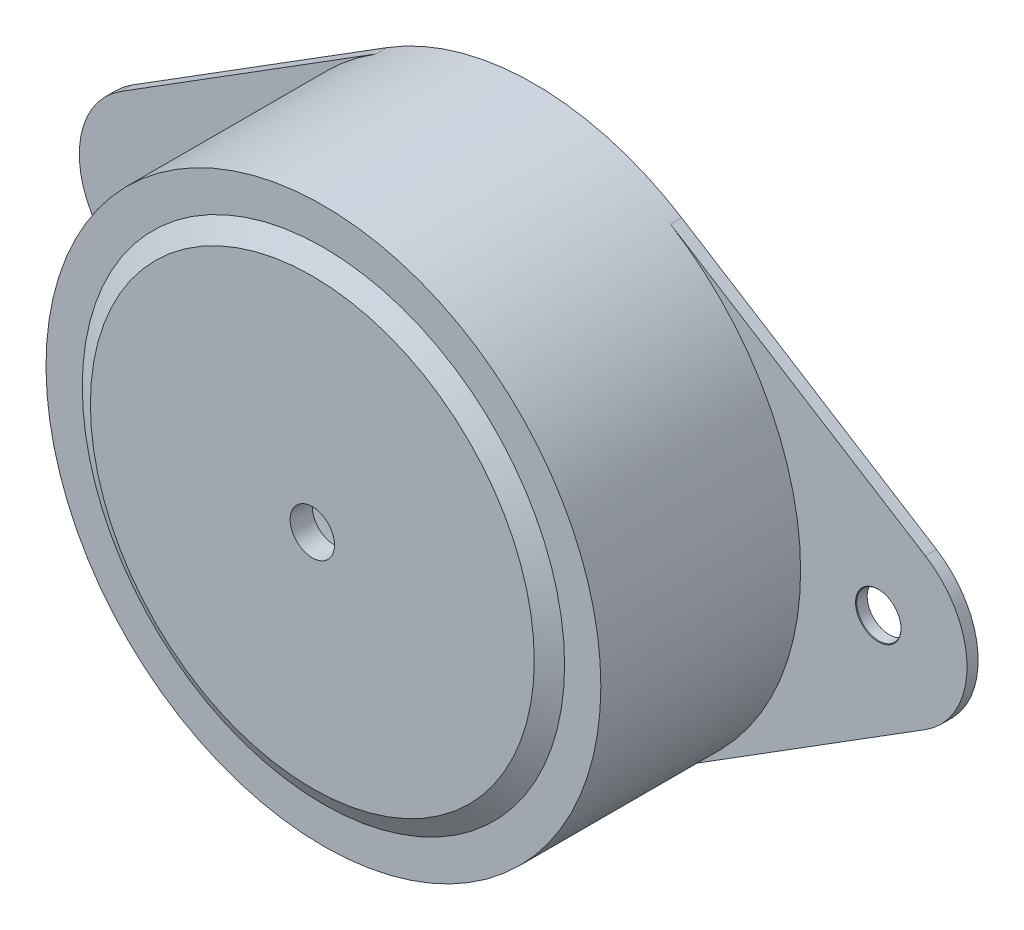
ISO-10303-21;
HEADER;
FILE_DESCRIPTION(('STEP AP214'),'2;1');
FILE_NAME('part.step','',(''),(''),'','','');
FILE_SCHEMA(('AUTOMOTIVE_DESIGN { 1 0 10303 214 1 1 1 1 }'));
ENDSEC;
DATA;
#1=APPLICATION_CONTEXT('core data for automotive mechanical design processes');
#2=APPLICATION_PROTOCOL_DEFINITION('international standard','automotive_design',2000,#1);
#3=PRODUCT_CONTEXT('',#1,'mechanical');
#4=PRODUCT('Part','Part','',(#3));
#5=PRODUCT_RELATED_PRODUCT_CATEGORY('part','',(#4));
#6=PRODUCT_DEFINITION_FORMATION('','',#4);
#7=PRODUCT_DEFINITION_CONTEXT('part definition',#1,'design');
#8=PRODUCT_DEFINITION('design','',#6,#7);
#9=PRODUCT_DEFINITION_SHAPE('','',#8);
#10=(LENGTH_UNIT() NAMED_UNIT(*) SI_UNIT(.MILLI.,.METRE.));
#11=(NAMED_UNIT(*) PLANE_ANGLE_UNIT() SI_UNIT($,.RADIAN.));
#12=(NAMED_UNIT(*) SI_UNIT($,.STERADIAN.) SOLID_ANGLE_UNIT());
#13=UNCERTAINTY_MEASURE_WITH_UNIT(LENGTH_MEASURE(1.E-05),#10,'distance_accuracy_value','');
#14=(GEOMETRIC_REPRESENTATION_CONTEXT(3) GLOBAL_UNCERTAINTY_ASSIGNED_CONTEXT((#13)) GLOBAL_UNIT_ASSIGNED_CONTEXT((#10,
#11,#12)) REPRESENTATION_CONTEXT('',''));
#15=CARTESIAN_POINT('',(0.,0.,0.));
#16=DIRECTION('',(0.,0.,1.));
#17=DIRECTION('',(1.,0.,0.));
#18=AXIS2_PLACEMENT_3D('',#15,#16,#17);
#19=CARTESIAN_POINT('',(0.,0.,9.));
#20=DIRECTION('',(0.,0.,-1.));
#21=DIRECTION('',(-1.,0.,0.));
#22=AXIS2_PLACEMENT_3D('',#19,#20,#21);
#23=CYLINDRICAL_SURFACE('',#22,12.);
#24=CARTESIAN_POINT('',(0.,0.,9.));
#25=DIRECTION('',(0.,0.,-1.));
#26=DIRECTION('',(-1.,0.,0.));
#27=AXIS2_PLACEMENT_3D('',#24,#25,#26);
#28=CIRCLE('',#27,12.);
#29=CARTESIAN_POINT('',(-12.,0.,9.));
#30=VERTEX_POINT('',#29);
#31=EDGE_CURVE('E207',#30,#30,#28,.T.);
#32=ORIENTED_EDGE('',*,*,#31,.F.);
#33=EDGE_LOOP('',(#32));
#34=FACE_BOUND('',#33,.T.);
#35=CARTESIAN_POINT('',(0.,0.,0.5));
#36=DIRECTION('',(0.,0.,-1.));
#37=DIRECTION('',(-1.,0.,0.));
#38=AXIS2_PLACEMENT_3D('',#35,#36,#37);
#39=CIRCLE('',#38,12.);
#40=CARTESIAN_POINT('',(-12.,0.,0.5));
#41=VERTEX_POINT('',#40);
#42=EDGE_CURVE('E13',#41,#41,#39,.F.);
#43=ORIENTED_EDGE('',*,*,#42,.F.);
#44=EDGE_LOOP('',(#43));
#45=FACE_BOUND('',#44,.T.);
#46=ADVANCED_FACE('F53',(#34,#45),#23,.F.);
#47=CARTESIAN_POINT('',(0.,0.,-2.50000000007189E-05));
#48=DIRECTION('',(0.,0.,1.));
#49=DIRECTION('',(1.,0.,0.));
#50=AXIS2_PLACEMENT_3D('',#47,#48,#49);
#51=CYLINDRICAL_SURFACE('',#50,1.);
#52=CARTESIAN_POINT('',(0.,0.,10.));
#53=DIRECTION('',(0.,0.,1.));
#54=DIRECTION('',(1.,0.,0.));
#55=AXIS2_PLACEMENT_3D('',#52,#53,#54);
#56=CIRCLE('',#55,1.);
#57=CARTESIAN_POINT('',(1.,0.,10.));
#58=VERTEX_POINT('',#57);
#59=EDGE_CURVE('E198',#58,#58,#56,.T.);
#60=ORIENTED_EDGE('',*,*,#59,.T.);
#61=EDGE_LOOP('',(#60));
#62=FACE_BOUND('',#61,.T.);
#63=CARTESIAN_POINT('',(0.,0.,9.));
#64=DIRECTION('',(0.,0.,-1.));
#65=DIRECTION('',(-1.,0.,0.));
#66=AXIS2_PLACEMENT_3D('',#63,#64,#65);
#67=CIRCLE('',#66,1.);
#68=CARTESIAN_POINT('',(-1.,0.,9.));
#69=VERTEX_POINT('',#68);
#70=EDGE_CURVE('E204',#69,#69,#67,.F.);
#71=ORIENTED_EDGE('',*,*,#70,.F.);
#72=EDGE_LOOP('',(#71));
#73=FACE_BOUND('',#72,.T.);
#74=ADVANCED_FACE('F285',(#62,#73),#51,.F.);
#75=CARTESIAN_POINT('',(-16.0000000000001,0.,0.5));
#76=DIRECTION('',(0.,0.,1.));
#77=DIRECTION('',(1.,0.,0.));
#78=AXIS2_PLACEMENT_3D('',#75,#76,#77);
#79=PLANE('',#78);
#80=CARTESIAN_POINT('',(-16.0000000000001,0.,0.5));
#81=DIRECTION('',(0.,0.,1.));
#82=DIRECTION('',(1.,0.,0.));
#83=AXIS2_PLACEMENT_3D('',#80,#81,#82);
#84=CIRCLE('',#83,1.025);
#85=CARTESIAN_POINT('',(-14.9750000000001,0.,0.5));
#86=VERTEX_POINT('',#85);
#87=EDGE_CURVE('E202',#86,#86,#84,.T.);
#88=ORIENTED_EDGE('',*,*,#87,.F.);
#89=EDGE_LOOP('',(#88));
#90=FACE_BOUND('',#89,.T.);
#91=CARTESIAN_POINT('',(0.,0.,0.5));
#92=DIRECTION('',(0.,0.,1.));
#93=DIRECTION('',(1.,0.,0.));
#94=AXIS2_PLACEMENT_3D('',#91,#92,#93);
#95=CIRCLE('',#94,12.5);
#96=CARTESIAN_POINT('',(-6.640625,10.5901888372859,0.5));
#97=VERTEX_POINT('',#96);
#98=CARTESIAN_POINT('',(-6.64062500000003,-10.590188837286,0.5));
#99=VERTEX_POINT('',#98);
#100=EDGE_CURVE('E164',#97,#99,#95,.T.);
#101=ORIENTED_EDGE('',*,*,#100,.F.);
#102=DIRECTION('',(-0.847215106982872,-0.53125,0.));
#103=VECTOR('',#102,1.);
#104=CARTESIAN_POINT('',(-18.125,3.38886042793138,0.5));
#105=LINE('',#104,#103);
#106=CARTESIAN_POINT('',(-18.125,3.38886042793138,0.5));
#107=VERTEX_POINT('',#106);
#108=EDGE_CURVE('E70',#97,#107,#105,.T.);
#109=ORIENTED_EDGE('',*,*,#108,.T.);
#110=CARTESIAN_POINT('',(-16.0000000000001,0.,0.5));
#111=DIRECTION('',(0.,0.,1.));
#112=DIRECTION('',(1.,0.,0.));
#113=AXIS2_PLACEMENT_3D('',#110,#111,#112);
#114=CIRCLE('',#113,4.);
#115=CARTESIAN_POINT('',(-18.125,-3.38886042793155,0.5));
#116=VERTEX_POINT('',#115);
#117=EDGE_CURVE('E179',#107,#116,#114,.T.);
#118=ORIENTED_EDGE('',*,*,#117,.T.);
#119=DIRECTION('',(0.847215106982873,-0.53125,0.));
#120=VECTOR('',#119,1.);
#121=CARTESIAN_POINT('',(-18.125,-3.38886042793155,0.5));
#122=LINE('',#121,#120);
#123=EDGE_CURVE('E115',#116,#99,#122,.T.);
#124=ORIENTED_EDGE('',*,*,#123,.T.);
#125=EDGE_LOOP('',(#101,#109,#118,#124));
#126=FACE_BOUND('',#125,.T.);
#127=ADVANCED_FACE('F291',(#90,#126),#79,.T.);
#128=CARTESIAN_POINT('',(-16.0000000000001,0.,0.5));
#129=DIRECTION('',(0.,0.,-1.));
#130=DIRECTION('',(-1.,0.,0.));
#131=AXIS2_PLACEMENT_3D('',#128,#129,#130);
#132=CYLINDRICAL_SURFACE('',#131,4.);
#133=CARTESIAN_POINT('',(-16.0000000000001,0.,0.));
#134=DIRECTION('',(0.,0.,1.));
#135=DIRECTION('',(1.,0.,0.));
#136=AXIS2_PLACEMENT_3D('',#133,#134,#135);
#137=CIRCLE('',#136,4.);
#138=CARTESIAN_POINT('',(-18.125,3.38886042793138,0.));
#139=VERTEX_POINT('',#138);
#140=CARTESIAN_POINT('',(-18.125,-3.38886042793155,0.));
#141=VERTEX_POINT('',#140);
#142=EDGE_CURVE('E236',#139,#141,#137,.T.);
#143=ORIENTED_EDGE('',*,*,#142,.T.);
#144=DIRECTION('',(0.,0.,-1.));
#145=VECTOR('',#144,1.);
#146=CARTESIAN_POINT('',(-18.125,-3.38886042793155,0.5));
#147=LINE('',#146,#145);
#148=EDGE_CURVE('E165',#116,#141,#147,.T.);
#149=ORIENTED_EDGE('',*,*,#148,.F.);
#150=ORIENTED_EDGE('',*,*,#117,.F.);
#151=DIRECTION('',(0.,0.,-1.));
#152=VECTOR('',#151,1.);
#153=CARTESIAN_POINT('',(-18.125,3.38886042793138,0.5));
#154=LINE('',#153,#152);
#155=EDGE_CURVE('E153',#107,#139,#154,.T.);
#156=ORIENTED_EDGE('',*,*,#155,.T.);
#157=EDGE_LOOP('',(#143,#149,#150,#156));
#158=FACE_BOUND('',#157,.T.);
#159=ADVANCED_FACE('F55',(#158),#132,.T.);
#160=CARTESIAN_POINT('',(-18.125,-3.38886042793155,0.5));
#161=DIRECTION('',(0.53125,0.847215106982873,0.));
#162=DIRECTION('',(-0.847215106982874,0.531250000000001,0.));
#163=AXIS2_PLACEMENT_3D('',#160,#161,#162);
#164=PLANE('',#163);
#165=DIRECTION('',(0.847215106982873,-0.53125,0.));
#166=VECTOR('',#165,1.);
#167=CARTESIAN_POINT('',(-18.125,-3.38886042793155,0.));
#168=LINE('',#167,#166);
#169=CARTESIAN_POINT('',(-6.64062500000003,-10.590188837286,0.));
#170=VERTEX_POINT('',#169);
#171=EDGE_CURVE('E240',#141,#170,#168,.T.);
#172=ORIENTED_EDGE('',*,*,#171,.T.);
#173=DIRECTION('',(0.,0.,-1.));
#174=VECTOR('',#173,1.);
#175=CARTESIAN_POINT('',(-6.64062500000003,-10.590188837286,0.5));
#176=LINE('',#175,#174);
#177=EDGE_CURVE('E182',#99,#170,#176,.T.);
#178=ORIENTED_EDGE('',*,*,#177,.F.);
#179=ORIENTED_EDGE('',*,*,#123,.F.);
#180=ORIENTED_EDGE('',*,*,#148,.T.);
#181=EDGE_LOOP('',(#172,#178,#179,#180));
#182=FACE_BOUND('',#181,.T.);
#183=ADVANCED_FACE('F478',(#182),#164,.F.);
#184=CARTESIAN_POINT('',(18.125,-3.38886042793156,0.5));
#185=DIRECTION('',(-0.53125,0.847215106982872,0.));
#186=DIRECTION('',(-0.847215106982873,-0.53125,0.));
#187=AXIS2_PLACEMENT_3D('',#184,#185,#186);
#188=PLANE('',#187);
#189=DIRECTION('',(0.847215106982872,0.53125,0.));
#190=VECTOR('',#189,1.);
#191=CARTESIAN_POINT('',(18.125,-3.38886042793156,0.));
#192=LINE('',#191,#190);
#193=CARTESIAN_POINT('',(6.640625,-10.590188837286,0.));
#194=VERTEX_POINT('',#193);
#195=CARTESIAN_POINT('',(18.125,-3.38886042793156,0.));
#196=VERTEX_POINT('',#195);
#197=EDGE_CURVE('E244',#194,#196,#192,.T.);
#198=ORIENTED_EDGE('',*,*,#197,.T.);
#199=DIRECTION('',(0.,0.,-1.));
#200=VECTOR('',#199,1.);
#201=CARTESIAN_POINT('',(18.125,-3.38886042793156,0.5));
#202=LINE('',#201,#200);
#203=CARTESIAN_POINT('',(18.125,-3.38886042793156,0.5));
#204=VERTEX_POINT('',#203);
#205=EDGE_CURVE('E147',#204,#196,#202,.T.);
#206=ORIENTED_EDGE('',*,*,#205,.F.);
#207=DIRECTION('',(0.847215106982872,0.53125,0.));
#208=VECTOR('',#207,1.);
#209=CARTESIAN_POINT('',(18.125,-3.38886042793156,0.5));
#210=LINE('',#209,#208);
#211=CARTESIAN_POINT('',(6.640625,-10.590188837286,0.5));
#212=VERTEX_POINT('',#211);
#213=EDGE_CURVE('E135',#212,#204,#210,.T.);
#214=ORIENTED_EDGE('',*,*,#213,.F.);
#215=DIRECTION('',(0.,0.,-1.));
#216=VECTOR('',#215,1.);
#217=CARTESIAN_POINT('',(6.640625,-10.590188837286,0.5));
#218=LINE('',#217,#216);
#219=EDGE_CURVE('E166',#212,#194,#218,.T.);
#220=ORIENTED_EDGE('',*,*,#219,.T.);
#221=EDGE_LOOP('',(#198,#206,#214,#220));
#222=FACE_BOUND('',#221,.T.);
#223=ADVANCED_FACE('F255',(#222),#188,.F.);
#224=CARTESIAN_POINT('',(16.,0.,0.5));
#225=DIRECTION('',(0.,0.,-1.));
#226=DIRECTION('',(-1.,0.,0.));
#227=AXIS2_PLACEMENT_3D('',#224,#225,#226);
#228=CYLINDRICAL_SURFACE('',#227,4.);
#229=CARTESIAN_POINT('',(16.,0.,0.));
#230=DIRECTION('',(0.,0.,1.));
#231=DIRECTION('',(-1.,0.,0.));
#232=AXIS2_PLACEMENT_3D('',#229,#230,#231);
#233=CIRCLE('',#232,4.);
#234=CARTESIAN_POINT('',(18.125,3.38886042793148,0.));
#235=VERTEX_POINT('',#234);
#236=EDGE_CURVE('E144',#196,#235,#233,.T.);
#237=ORIENTED_EDGE('',*,*,#236,.T.);
#238=DIRECTION('',(0.,0.,-1.));
#239=VECTOR('',#238,1.);
#240=CARTESIAN_POINT('',(18.125,3.38886042793148,0.5));
#241=LINE('',#240,#239);
#242=CARTESIAN_POINT('',(18.125,3.38886042793148,0.5));
#243=VERTEX_POINT('',#242);
#244=EDGE_CURVE('E141',#243,#235,#241,.T.);
#245=ORIENTED_EDGE('',*,*,#244,.F.);
#246=CARTESIAN_POINT('',(16.,0.,0.5));
#247=DIRECTION('',(0.,0.,1.));
#248=DIRECTION('',(-1.,0.,0.));
#249=AXIS2_PLACEMENT_3D('',#246,#247,#248);
#250=CIRCLE('',#249,4.);
#251=EDGE_CURVE('E128',#204,#243,#250,.T.);
#252=ORIENTED_EDGE('',*,*,#251,.F.);
#253=ORIENTED_EDGE('',*,*,#205,.T.);
#254=EDGE_LOOP('',(#237,#245,#252,#253));
#255=FACE_BOUND('',#254,.T.);
#256=ADVANCED_FACE('F142',(#255),#228,.T.);
#257=CARTESIAN_POINT('',(18.125,3.38886042793148,0.5));
#258=DIRECTION('',(-0.53125,-0.847215106982873,0.));
#259=DIRECTION('',(0.847215106982874,-0.531250000000001,0.));
#260=AXIS2_PLACEMENT_3D('',#257,#258,#259);
#261=PLANE('',#260);
#262=DIRECTION('',(-0.847215106982873,0.53125,0.));
#263=VECTOR('',#262,1.);
#264=CARTESIAN_POINT('',(18.125,3.38886042793148,0.));
#265=LINE('',#264,#263);
#266=CARTESIAN_POINT('',(6.640625,10.5901888372859,0.));
#267=VERTEX_POINT('',#266);
#268=EDGE_CURVE('E247',#235,#267,#265,.T.);
#269=ORIENTED_EDGE('',*,*,#268,.T.);
#270=DIRECTION('',(0.,0.,-1.));
#271=VECTOR('',#270,1.);
#272=CARTESIAN_POINT('',(6.640625,10.5901888372859,0.5));
#273=LINE('',#272,#271);
#274=CARTESIAN_POINT('',(6.640625,10.5901888372859,0.5));
#275=VERTEX_POINT('',#274);
#276=EDGE_CURVE('E148',#275,#267,#273,.T.);
#277=ORIENTED_EDGE('',*,*,#276,.F.);
#278=DIRECTION('',(-0.847215106982873,0.53125,0.));
#279=VECTOR('',#278,1.);
#280=CARTESIAN_POINT('',(18.125,3.38886042793148,0.5));
#281=LINE('',#280,#279);
#282=EDGE_CURVE('E132',#243,#275,#281,.T.);
#283=ORIENTED_EDGE('',*,*,#282,.F.);
#284=ORIENTED_EDGE('',*,*,#244,.T.);
#285=EDGE_LOOP('',(#269,#277,#283,#284));
#286=FACE_BOUND('',#285,.T.);
#287=ADVANCED_FACE('F151',(#286),#261,.F.);
#288=CARTESIAN_POINT('',(0.,0.,0.5));
#289=DIRECTION('',(0.,0.,-1.));
#290=DIRECTION('',(-1.,0.,0.));
#291=AXIS2_PLACEMENT_3D('',#288,#289,#290);
#292=CYLINDRICAL_SURFACE('',#291,12.5);
#293=CARTESIAN_POINT('',(0.,0.,0.));
#294=DIRECTION('',(0.,0.,1.));
#295=DIRECTION('',(1.,0.,0.));
#296=AXIS2_PLACEMENT_3D('',#293,#294,#295);
#297=CIRCLE('',#296,12.5);
#298=CARTESIAN_POINT('',(-6.640625,10.5901888372859,0.));
#299=VERTEX_POINT('',#298);
#300=EDGE_CURVE('E100',#267,#299,#297,.T.);
#301=ORIENTED_EDGE('',*,*,#300,.T.);
#302=DIRECTION('',(0.,0.,-1.));
#303=VECTOR('',#302,1.);
#304=CARTESIAN_POINT('',(-6.640625,10.5901888372859,0.5));
#305=LINE('',#304,#303);
#306=EDGE_CURVE('E187',#97,#299,#305,.T.);
#307=ORIENTED_EDGE('',*,*,#306,.F.);
#308=ORIENTED_EDGE('',*,*,#100,.T.);
#309=ORIENTED_EDGE('',*,*,#177,.T.);
#310=CARTESIAN_POINT('',(0.,0.,0.));
#311=DIRECTION('',(0.,0.,1.));
#312=DIRECTION('',(-1.,0.,0.));
#313=AXIS2_PLACEMENT_3D('',#310,#311,#312);
#314=CIRCLE('',#313,12.5);
#315=EDGE_CURVE('E242',#170,#194,#314,.T.);
#316=ORIENTED_EDGE('',*,*,#315,.T.);
#317=ORIENTED_EDGE('',*,*,#219,.F.);
#318=EDGE_CURVE('E161',#212,#275,#95,.T.);
#319=ORIENTED_EDGE('',*,*,#318,.T.);
#320=ORIENTED_EDGE('',*,*,#276,.T.);
#321=EDGE_LOOP('',(#301,#307,#308,#309,#316,#317,#319,#320));
#322=FACE_BOUND('',#321,.T.);
#323=CARTESIAN_POINT('',(0.,0.,9.5));
#324=DIRECTION('',(0.,0.,1.));
#325=DIRECTION('',(1.,0.,0.));
#326=AXIS2_PLACEMENT_3D('',#323,#324,#325);
#327=CIRCLE('',#326,12.5);
#328=CARTESIAN_POINT('',(12.5,0.,9.5));
#329=VERTEX_POINT('',#328);
#330=EDGE_CURVE('E233',#329,#329,#327,.T.);
#331=ORIENTED_EDGE('',*,*,#330,.F.);
#332=EDGE_LOOP('',(#331));
#333=FACE_BOUND('',#332,.T.);
#334=ADVANCED_FACE('F261',(#322,#333),#292,.T.);
#335=CARTESIAN_POINT('',(-18.125,3.38886042793138,0.5));
#336=DIRECTION('',(0.53125,-0.847215106982872,0.));
#337=DIRECTION('',(0.847215106982873,0.53125,0.));
#338=AXIS2_PLACEMENT_3D('',#335,#336,#337);
#339=PLANE('',#338);
#340=DIRECTION('',(-0.847215106982872,-0.53125,0.));
#341=VECTOR('',#340,1.);
#342=CARTESIAN_POINT('',(-18.125,3.38886042793138,0.));
#343=LINE('',#342,#341);
#344=EDGE_CURVE('E106',#299,#139,#343,.T.);
#345=ORIENTED_EDGE('',*,*,#344,.T.);
#346=ORIENTED_EDGE('',*,*,#155,.F.);
#347=ORIENTED_EDGE('',*,*,#108,.F.);
#348=ORIENTED_EDGE('',*,*,#306,.T.);
#349=EDGE_LOOP('',(#345,#346,#347,#348));
#350=FACE_BOUND('',#349,.T.);
#351=ADVANCED_FACE('F264',(#350),#339,.F.);
#352=CARTESIAN_POINT('',(16.,0.,0.5));
#353=DIRECTION('',(0.,0.,1.));
#354=DIRECTION('',(1.,0.,0.));
#355=AXIS2_PLACEMENT_3D('',#352,#353,#354);
#356=CIRCLE('',#355,1.025);
#357=CARTESIAN_POINT('',(17.025,0.,0.5));
#358=VERTEX_POINT('',#357);
#359=EDGE_CURVE('E206',#358,#358,#356,.T.);
#360=ORIENTED_EDGE('',*,*,#359,.F.);
#361=EDGE_LOOP('',(#360));
#362=FACE_BOUND('',#361,.T.);
#363=ORIENTED_EDGE('',*,*,#318,.F.);
#364=ORIENTED_EDGE('',*,*,#213,.T.);
#365=ORIENTED_EDGE('',*,*,#251,.T.);
#366=ORIENTED_EDGE('',*,*,#282,.T.);
#367=EDGE_LOOP('',(#363,#364,#365,#366));
#368=FACE_BOUND('',#367,.T.);
#369=ADVANCED_FACE('F130',(#362,#368),#79,.T.);
#370=CARTESIAN_POINT('',(-16.0000000000001,0.,0.));
#371=DIRECTION('',(0.,0.,1.));
#372=DIRECTION('',(1.,0.,0.));
#373=AXIS2_PLACEMENT_3D('',#370,#371,#372);
#374=PLANE('',#373);
#375=CARTESIAN_POINT('',(16.,0.,0.));
#376=DIRECTION('',(0.,0.,1.));
#377=DIRECTION('',(1.,0.,0.));
#378=AXIS2_PLACEMENT_3D('',#375,#376,#377);
#379=CIRCLE('',#378,0.999999999999999);
#380=CARTESIAN_POINT('',(17.,0.,0.));
#381=VERTEX_POINT('',#380);
#382=EDGE_CURVE('E200',#381,#381,#379,.T.);
#383=ORIENTED_EDGE('',*,*,#382,.T.);
#384=EDGE_LOOP('',(#383));
#385=FACE_BOUND('',#384,.T.);
#386=CARTESIAN_POINT('',(-16.0000000000001,0.,0.));
#387=DIRECTION('',(0.,0.,1.));
#388=DIRECTION('',(1.,0.,0.));
#389=AXIS2_PLACEMENT_3D('',#386,#387,#388);
#390=CIRCLE('',#389,0.999999999999999);
#391=CARTESIAN_POINT('',(-15.0000000000001,0.,0.));
#392=VERTEX_POINT('',#391);
#393=EDGE_CURVE('E195',#392,#392,#390,.T.);
#394=ORIENTED_EDGE('',*,*,#393,.T.);
#395=EDGE_LOOP('',(#394));
#396=FACE_BOUND('',#395,.T.);
#397=ORIENTED_EDGE('',*,*,#142,.F.);
#398=ORIENTED_EDGE('',*,*,#344,.F.);
#399=ORIENTED_EDGE('',*,*,#300,.F.);
#400=ORIENTED_EDGE('',*,*,#268,.F.);
#401=ORIENTED_EDGE('',*,*,#236,.F.);
#402=ORIENTED_EDGE('',*,*,#197,.F.);
#403=ORIENTED_EDGE('',*,*,#315,.F.);
#404=ORIENTED_EDGE('',*,*,#171,.F.);
#405=EDGE_LOOP('',(#397,#398,#399,#400,#401,#402,#403,#404));
#406=FACE_BOUND('',#405,.T.);
#407=CARTESIAN_POINT('',(0.,0.,0.));
#408=DIRECTION('',(0.,0.,-1.));
#409=DIRECTION('',(-1.,0.,0.));
#410=AXIS2_PLACEMENT_3D('',#407,#408,#409);
#411=CIRCLE('',#410,1.00000000000001);
#412=CARTESIAN_POINT('',(-1.00000000000002,0.,0.));
#413=VERTEX_POINT('',#412);
#414=EDGE_CURVE('E218',#413,#413,#411,.T.);
#415=ORIENTED_EDGE('',*,*,#414,.F.);
#416=EDGE_LOOP('',(#415));
#417=FACE_BOUND('',#416,.T.);
#418=ADVANCED_FACE('F259',(#385,#396,#406,#417),#374,.F.);
#419=CARTESIAN_POINT('',(0.,0.,9.5));
#420=DIRECTION('',(0.,0.,1.));
#421=DIRECTION('',(1.,0.,0.));
#422=AXIS2_PLACEMENT_3D('',#419,#420,#421);
#423=PLANE('',#422);
#424=CARTESIAN_POINT('',(0.,0.,9.5));
#425=DIRECTION('',(0.,0.,1.));
#426=DIRECTION('',(1.,0.,0.));
#427=AXIS2_PLACEMENT_3D('',#424,#425,#426);
#428=CIRCLE('',#427,10.8660254037845);
#429=CARTESIAN_POINT('',(10.8660254037845,0.,9.5));
#430=VERTEX_POINT('',#429);
#431=EDGE_CURVE('E62',#430,#430,#428,.T.);
#432=ORIENTED_EDGE('',*,*,#431,.F.);
#433=EDGE_LOOP('',(#432));
#434=FACE_BOUND('',#433,.T.);
#435=ORIENTED_EDGE('',*,*,#330,.T.);
#436=EDGE_LOOP('',(#435));
#437=FACE_BOUND('',#436,.T.);
#438=ADVANCED_FACE('F268',(#434,#437),#423,.T.);
#439=CARTESIAN_POINT('',(0.,9.99999999999998,10.));
#440=DIRECTION('',(0.,0.,1.));
#441=DIRECTION('',(1.,0.,0.));
#442=AXIS2_PLACEMENT_3D('',#439,#440,#441);
#443=PLANE('',#442);
#444=ORIENTED_EDGE('',*,*,#59,.F.);
#445=EDGE_LOOP('',(#444));
#446=FACE_BOUND('',#445,.T.);
#447=CARTESIAN_POINT('',(0.,0.,10.));
#448=DIRECTION('',(0.,0.,-1.));
#449=DIRECTION('',(-1.,0.,0.));
#450=AXIS2_PLACEMENT_3D('',#447,#448,#449);
#451=CIRCLE('',#450,10.);
#452=CARTESIAN_POINT('',(-10.,0.,10.));
#453=VERTEX_POINT('',#452);
#454=EDGE_CURVE('E230',#453,#453,#451,.T.);
#455=ORIENTED_EDGE('',*,*,#454,.F.);
#456=EDGE_LOOP('',(#455));
#457=FACE_BOUND('',#456,.T.);
#458=ADVANCED_FACE('F270',(#446,#457),#443,.T.);
#459=CARTESIAN_POINT('',(0.,0.,9.5));
#460=DIRECTION('',(0.,0.,-1.));
#461=DIRECTION('',(-1.,0.,0.));
#462=AXIS2_PLACEMENT_3D('',#459,#460,#461);
#463=CONICAL_SURFACE('',#462,10.8660254037845,1.0471975511966);
#464=ORIENTED_EDGE('',*,*,#454,.T.);
#465=EDGE_LOOP('',(#464));
#466=FACE_BOUND('',#465,.T.);
#467=ORIENTED_EDGE('',*,*,#431,.T.);
#468=EDGE_LOOP('',(#467));
#469=FACE_BOUND('',#468,.T.);
#470=ADVANCED_FACE('F277',(#466,#469),#463,.T.);
#471=CARTESIAN_POINT('',(-16.0000000000001,0.,0.5));
#472=DIRECTION('',(0.,0.,1.));
#473=DIRECTION('',(1.,0.,0.));
#474=AXIS2_PLACEMENT_3D('',#471,#472,#473);
#475=CYLINDRICAL_SURFACE('',#474,0.999999999999999);
#476=CARTESIAN_POINT('',(-16.0000000000001,0.,0.475));
#477=DIRECTION('',(0.,0.,1.));
#478=DIRECTION('',(1.,0.,0.));
#479=AXIS2_PLACEMENT_3D('',#476,#477,#478);
#480=CIRCLE('',#479,0.999999999999999);
#481=CARTESIAN_POINT('',(-15.0000000000001,0.,0.475));
#482=VERTEX_POINT('',#481);
#483=EDGE_CURVE('E199',#482,#482,#480,.T.);
#484=ORIENTED_EDGE('',*,*,#483,.T.);
#485=EDGE_LOOP('',(#484));
#486=FACE_BOUND('',#485,.T.);
#487=ORIENTED_EDGE('',*,*,#393,.F.);
#488=EDGE_LOOP('',(#487));
#489=FACE_BOUND('',#488,.T.);
#490=ADVANCED_FACE('F310',(#486,#489),#475,.F.);
#491=CARTESIAN_POINT('',(-16.0000000000001,0.,0.5));
#492=DIRECTION('',(0.,0.,1.));
#493=DIRECTION('',(1.,0.,0.));
#494=AXIS2_PLACEMENT_3D('',#491,#492,#493);
#495=CONICAL_SURFACE('',#494,1.025,0.785398163397456);
#496=ORIENTED_EDGE('',*,*,#483,.F.);
#497=EDGE_LOOP('',(#496));
#498=FACE_BOUND('',#497,.T.);
#499=ORIENTED_EDGE('',*,*,#87,.T.);
#500=EDGE_LOOP('',(#499));
#501=FACE_BOUND('',#500,.T.);
#502=ADVANCED_FACE('F306',(#498,#501),#495,.F.);
#503=CARTESIAN_POINT('',(16.,0.,0.5));
#504=DIRECTION('',(0.,0.,1.));
#505=DIRECTION('',(1.,0.,0.));
#506=AXIS2_PLACEMENT_3D('',#503,#504,#505);
#507=CYLINDRICAL_SURFACE('',#506,0.999999999999999);
#508=CARTESIAN_POINT('',(16.,0.,0.475));
#509=DIRECTION('',(0.,0.,1.));
#510=DIRECTION('',(1.,0.,0.));
#511=AXIS2_PLACEMENT_3D('',#508,#509,#510);
#512=CIRCLE('',#511,1.);
#513=CARTESIAN_POINT('',(17.,0.,0.475));
#514=VERTEX_POINT('',#513);
#515=EDGE_CURVE('E203',#514,#514,#512,.T.);
#516=ORIENTED_EDGE('',*,*,#515,.T.);
#517=EDGE_LOOP('',(#516));
#518=FACE_BOUND('',#517,.T.);
#519=ORIENTED_EDGE('',*,*,#382,.F.);
#520=EDGE_LOOP('',(#519));
#521=FACE_BOUND('',#520,.T.);
#522=ADVANCED_FACE('F302',(#518,#521),#507,.F.);
#523=CARTESIAN_POINT('',(16.,0.,0.5));
#524=DIRECTION('',(0.,0.,1.));
#525=DIRECTION('',(1.,0.,0.));
#526=AXIS2_PLACEMENT_3D('',#523,#524,#525);
#527=CONICAL_SURFACE('',#526,1.025,0.785398163397387);
#528=ORIENTED_EDGE('',*,*,#515,.F.);
#529=EDGE_LOOP('',(#528));
#530=FACE_BOUND('',#529,.T.);
#531=ORIENTED_EDGE('',*,*,#359,.T.);
#532=EDGE_LOOP('',(#531));
#533=FACE_BOUND('',#532,.T.);
#534=ADVANCED_FACE('F299',(#530,#533),#527,.F.);
#535=CARTESIAN_POINT('',(0.,0.,9.));
#536=DIRECTION('',(0.,0.,-1.));
#537=DIRECTION('',(-1.,0.,0.));
#538=AXIS2_PLACEMENT_3D('',#535,#536,#537);
#539=PLANE('',#538);
#540=ORIENTED_EDGE('',*,*,#31,.T.);
#541=EDGE_LOOP('',(#540));
#542=FACE_BOUND('',#541,.T.);
#543=ORIENTED_EDGE('',*,*,#70,.T.);
#544=EDGE_LOOP('',(#543));
#545=FACE_BOUND('',#544,.T.);
#546=ADVANCED_FACE('F297',(#542,#545),#539,.T.);
#547=CARTESIAN_POINT('',(0.,0.,0.5));
#548=DIRECTION('',(0.,0.,-1.));
#549=DIRECTION('',(-1.,0.,0.));
#550=AXIS2_PLACEMENT_3D('',#547,#548,#549);
#551=PLANE('',#550);
#552=CARTESIAN_POINT('',(0.,0.,0.5));
#553=DIRECTION('',(0.,0.,-1.));
#554=DIRECTION('',(-1.,0.,0.));
#555=AXIS2_PLACEMENT_3D('',#552,#553,#554);
#556=CIRCLE('',#555,1.00000000000001);
#557=CARTESIAN_POINT('',(-1.00000000000002,0.,0.5));
#558=VERTEX_POINT('',#557);
#559=EDGE_CURVE('E213',#558,#558,#556,.T.);
#560=ORIENTED_EDGE('',*,*,#559,.T.);
#561=EDGE_LOOP('',(#560));
#562=FACE_BOUND('',#561,.T.);
#563=ORIENTED_EDGE('',*,*,#42,.T.);
#564=EDGE_LOOP('',(#563));
#565=FACE_BOUND('',#564,.T.);
#566=ADVANCED_FACE('F346',(#562,#565),#551,.F.);
#567=CARTESIAN_POINT('',(0.,0.,0.5));
#568=DIRECTION('',(0.,0.,-1.));
#569=DIRECTION('',(-1.,0.,0.));
#570=AXIS2_PLACEMENT_3D('',#567,#568,#569);
#571=CYLINDRICAL_SURFACE('',#570,1.00000000000001);
#572=ORIENTED_EDGE('',*,*,#559,.F.);
#573=EDGE_LOOP('',(#572));
#574=FACE_BOUND('',#573,.T.);
#575=ORIENTED_EDGE('',*,*,#414,.T.);
#576=EDGE_LOOP('',(#575));
#577=FACE_BOUND('',#576,.T.);
#578=ADVANCED_FACE('F352',(#574,#577),#571,.F.);
#579=CLOSED_SHELL('',(#46,#74,#127,#159,#183,#223,#256,#287,#334,#351,#369,#418,#438,#458,#470,
#490,#502,#522,#534,#546,#566,#578));
#580=MANIFOLD_SOLID_BREP('B2',#579);
#581=ADVANCED_BREP_SHAPE_REPRESENTATION('',(#18,#580),#14);
#582=SHAPE_DEFINITION_REPRESENTATION(#9,#581);
ENDSEC;
END-ISO-10303-21;
